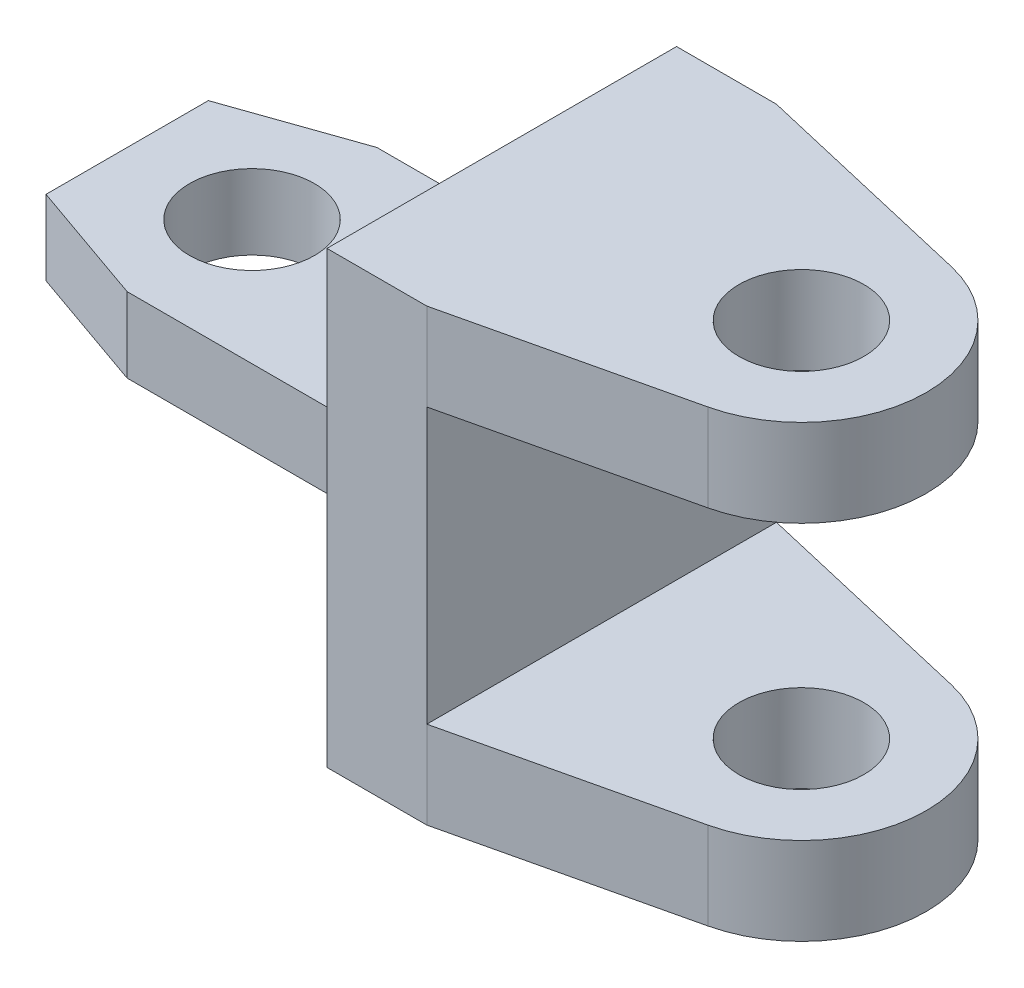
ISO-10303-21;
HEADER;
FILE_DESCRIPTION(('STEP AP214'),'2;1');
FILE_NAME('part.step','',(''),(''),'','','');
FILE_SCHEMA(('AUTOMOTIVE_DESIGN { 1 0 10303 214 1 1 1 1 }'));
ENDSEC;
DATA;
#1=APPLICATION_CONTEXT('core data for automotive mechanical design processes');
#2=APPLICATION_PROTOCOL_DEFINITION('international standard','automotive_design',2000,#1);
#3=PRODUCT_CONTEXT('',#1,'mechanical');
#4=PRODUCT('Part','Part','',(#3));
#5=PRODUCT_RELATED_PRODUCT_CATEGORY('part','',(#4));
#6=PRODUCT_DEFINITION_FORMATION('','',#4);
#7=PRODUCT_DEFINITION_CONTEXT('part definition',#1,'design');
#8=PRODUCT_DEFINITION('design','',#6,#7);
#9=PRODUCT_DEFINITION_SHAPE('','',#8);
#10=(LENGTH_UNIT() NAMED_UNIT(*) SI_UNIT(.MILLI.,.METRE.));
#11=(NAMED_UNIT(*) PLANE_ANGLE_UNIT() SI_UNIT($,.RADIAN.));
#12=(NAMED_UNIT(*) SI_UNIT($,.STERADIAN.) SOLID_ANGLE_UNIT());
#13=UNCERTAINTY_MEASURE_WITH_UNIT(LENGTH_MEASURE(1.E-05),#10,'distance_accuracy_value','');
#14=(GEOMETRIC_REPRESENTATION_CONTEXT(3) GLOBAL_UNCERTAINTY_ASSIGNED_CONTEXT((#13)) GLOBAL_UNIT_ASSIGNED_CONTEXT((#10,
#11,#12)) REPRESENTATION_CONTEXT('',''));
#15=CARTESIAN_POINT('',(0.,0.,0.));
#16=DIRECTION('',(0.,0.,1.));
#17=DIRECTION('',(1.,0.,0.));
#18=AXIS2_PLACEMENT_3D('',#15,#16,#17);
#19=CARTESIAN_POINT('',(3.50943705038397,-18.,15.0473193047414));
#20=DIRECTION('',(0.227131156084319,0.,0.973864178382078));
#21=DIRECTION('',(0.973864178382079,0.,-0.227131156084319));
#22=AXIS2_PLACEMENT_3D('',#19,#20,#21);
#23=PLANE('',#22);
#24=DIRECTION('',(0.973864178382079,0.,-0.227131156084319));
#25=VECTOR('',#24,1.);
#26=CARTESIAN_POINT('',(3.50943705038397,-11.,15.0473193047414));
#27=LINE('',#26,#25);
#28=CARTESIAN_POINT('',(8.,-11.,14.));
#29=VERTEX_POINT('',#28);
#30=CARTESIAN_POINT('',(26.2713115608432,-11.,9.73864178382079));
#31=VERTEX_POINT('',#30);
#32=EDGE_CURVE('E217',#29,#31,#27,.T.);
#33=ORIENTED_EDGE('',*,*,#32,.F.);
#34=DIRECTION('',(0.,1.,0.));
#35=VECTOR('',#34,1.);
#36=CARTESIAN_POINT('',(8.,-18.,14.));
#37=LINE('',#36,#35);
#38=CARTESIAN_POINT('',(8.,-18.,14.));
#39=VERTEX_POINT('',#38);
#40=EDGE_CURVE('E193',#39,#29,#37,.T.);
#41=ORIENTED_EDGE('',*,*,#40,.F.);
#42=DIRECTION('',(0.973864178382079,0.,-0.227131156084319));
#43=VECTOR('',#42,1.);
#44=CARTESIAN_POINT('',(3.50943705038397,-18.,15.0473193047414));
#45=LINE('',#44,#43);
#46=CARTESIAN_POINT('',(26.2713115608432,-18.,9.73864178382079));
#47=VERTEX_POINT('',#46);
#48=EDGE_CURVE('E334',#39,#47,#45,.T.);
#49=ORIENTED_EDGE('',*,*,#48,.T.);
#50=DIRECTION('',(0.,1.,0.));
#51=VECTOR('',#50,1.);
#52=CARTESIAN_POINT('',(26.2713115608432,-18.,9.73864178382079));
#53=LINE('',#52,#51);
#54=EDGE_CURVE('E373',#47,#31,#53,.T.);
#55=ORIENTED_EDGE('',*,*,#54,.T.);
#56=EDGE_LOOP('',(#33,#41,#49,#55));
#57=FACE_BOUND('',#56,.T.);
#58=ADVANCED_FACE('F49',(#57),#23,.T.);
#59=CARTESIAN_POINT('',(3.50943705038397,-18.,-15.0473193047414));
#60=DIRECTION('',(-0.227131156084319,0.,0.973864178382078));
#61=DIRECTION('',(0.973864178382079,0.,0.227131156084319));
#62=AXIS2_PLACEMENT_3D('',#59,#60,#61);
#63=PLANE('',#62);
#64=DIRECTION('',(0.,1.,0.));
#65=VECTOR('',#64,1.);
#66=CARTESIAN_POINT('',(8.,-18.,-14.));
#67=LINE('',#66,#65);
#68=CARTESIAN_POINT('',(8.,-18.,-14.));
#69=VERTEX_POINT('',#68);
#70=CARTESIAN_POINT('',(8.,-11.,-14.));
#71=VERTEX_POINT('',#70);
#72=EDGE_CURVE('E363',#69,#71,#67,.T.);
#73=ORIENTED_EDGE('',*,*,#72,.T.);
#74=DIRECTION('',(0.973864178382079,0.,0.227131156084319));
#75=VECTOR('',#74,1.);
#76=CARTESIAN_POINT('',(3.50943705038397,-11.,-15.0473193047414));
#77=LINE('',#76,#75);
#78=CARTESIAN_POINT('',(26.2713115608432,-11.,-9.73864178382079));
#79=VERTEX_POINT('',#78);
#80=EDGE_CURVE('E213',#71,#79,#77,.T.);
#81=ORIENTED_EDGE('',*,*,#80,.T.);
#82=DIRECTION('',(0.,1.,0.));
#83=VECTOR('',#82,1.);
#84=CARTESIAN_POINT('',(26.2713115608432,-18.,-9.73864178382079));
#85=LINE('',#84,#83);
#86=CARTESIAN_POINT('',(26.2713115608432,-18.,-9.73864178382079));
#87=VERTEX_POINT('',#86);
#88=EDGE_CURVE('E368',#87,#79,#85,.T.);
#89=ORIENTED_EDGE('',*,*,#88,.F.);
#90=DIRECTION('',(0.973864178382079,0.,0.227131156084319));
#91=VECTOR('',#90,1.);
#92=CARTESIAN_POINT('',(3.50943705038397,-18.,-15.0473193047414));
#93=LINE('',#92,#91);
#94=EDGE_CURVE('E342',#69,#87,#93,.T.);
#95=ORIENTED_EDGE('',*,*,#94,.F.);
#96=EDGE_LOOP('',(#73,#81,#89,#95));
#97=FACE_BOUND('',#96,.T.);
#98=ADVANCED_FACE('F521',(#97),#63,.F.);
#99=CARTESIAN_POINT('',(24.,-18.,0.));
#100=DIRECTION('',(0.,1.,0.));
#101=DIRECTION('',(0.,0.,1.));
#102=AXIS2_PLACEMENT_3D('',#99,#100,#101);
#103=CYLINDRICAL_SURFACE('',#102,5.);
#104=CARTESIAN_POINT('',(24.,-11.,0.));
#105=DIRECTION('',(0.,-1.,0.));
#106=DIRECTION('',(1.,0.,0.));
#107=AXIS2_PLACEMENT_3D('',#104,#105,#106);
#108=CIRCLE('',#107,5.);
#109=CARTESIAN_POINT('',(29.,-11.,0.));
#110=VERTEX_POINT('',#109);
#111=EDGE_CURVE('E220',#110,#110,#108,.F.);
#112=ORIENTED_EDGE('',*,*,#111,.T.);
#113=EDGE_LOOP('',(#112));
#114=FACE_BOUND('',#113,.T.);
#115=CARTESIAN_POINT('',(24.,-18.,0.));
#116=DIRECTION('',(0.,1.,0.));
#117=DIRECTION('',(0.,0.,1.));
#118=AXIS2_PLACEMENT_3D('',#115,#116,#117);
#119=CIRCLE('',#118,5.);
#120=CARTESIAN_POINT('',(24.,-18.,5.));
#121=VERTEX_POINT('',#120);
#122=EDGE_CURVE('E330',#121,#121,#119,.T.);
#123=ORIENTED_EDGE('',*,*,#122,.F.);
#124=EDGE_LOOP('',(#123));
#125=FACE_BOUND('',#124,.T.);
#126=ADVANCED_FACE('F535',(#114,#125),#103,.F.);
#127=CARTESIAN_POINT('',(24.,-18.,0.));
#128=DIRECTION('',(0.,1.,0.));
#129=DIRECTION('',(0.,0.,1.));
#130=AXIS2_PLACEMENT_3D('',#127,#128,#129);
#131=CYLINDRICAL_SURFACE('',#130,10.);
#132=CARTESIAN_POINT('',(24.,-11.,0.));
#133=DIRECTION('',(0.,-1.,0.));
#134=DIRECTION('',(1.,0.,0.));
#135=AXIS2_PLACEMENT_3D('',#132,#133,#134);
#136=CIRCLE('',#135,10.);
#137=EDGE_CURVE('E11',#31,#79,#136,.F.);
#138=ORIENTED_EDGE('',*,*,#137,.F.);
#139=ORIENTED_EDGE('',*,*,#54,.F.);
#140=CARTESIAN_POINT('',(24.,-18.,0.));
#141=DIRECTION('',(0.,1.,0.));
#142=DIRECTION('',(0.,0.,1.));
#143=AXIS2_PLACEMENT_3D('',#140,#141,#142);
#144=CIRCLE('',#143,10.);
#145=EDGE_CURVE('E338',#47,#87,#144,.T.);
#146=ORIENTED_EDGE('',*,*,#145,.T.);
#147=ORIENTED_EDGE('',*,*,#88,.T.);
#148=EDGE_LOOP('',(#138,#139,#146,#147));
#149=FACE_BOUND('',#148,.T.);
#150=ADVANCED_FACE('F518',(#149),#131,.T.);
#151=DIRECTION('',(-0.973864178382079,0.,0.227131156084319));
#152=VECTOR('',#151,1.);
#153=CARTESIAN_POINT('',(3.50943705038396,11.,15.0473193047414));
#154=LINE('',#153,#152);
#155=CARTESIAN_POINT('',(26.2713115608432,11.,9.73864178382079));
#156=VERTEX_POINT('',#155);
#157=CARTESIAN_POINT('',(8.,11.,14.));
#158=VERTEX_POINT('',#157);
#159=EDGE_CURVE('E160',#156,#158,#154,.T.);
#160=ORIENTED_EDGE('',*,*,#159,.F.);
#161=CARTESIAN_POINT('',(26.2713115608432,18.,9.73864178382079));
#162=VERTEX_POINT('',#161);
#163=EDGE_CURVE('E355',#156,#162,#53,.T.);
#164=ORIENTED_EDGE('',*,*,#163,.T.);
#165=DIRECTION('',(0.973864178382079,0.,-0.227131156084319));
#166=VECTOR('',#165,1.);
#167=CARTESIAN_POINT('',(3.50943705038397,18.,15.0473193047414));
#168=LINE('',#167,#166);
#169=CARTESIAN_POINT('',(8.,18.,14.));
#170=VERTEX_POINT('',#169);
#171=EDGE_CURVE('E188',#170,#162,#168,.T.);
#172=ORIENTED_EDGE('',*,*,#171,.F.);
#173=EDGE_CURVE('E185',#158,#170,#37,.T.);
#174=ORIENTED_EDGE('',*,*,#173,.F.);
#175=EDGE_LOOP('',(#160,#164,#172,#174));
#176=FACE_BOUND('',#175,.T.);
#177=ADVANCED_FACE('F186',(#176),#23,.T.);
#178=CARTESIAN_POINT('',(0.,-18.,14.));
#179=DIRECTION('',(0.,0.,1.));
#180=DIRECTION('',(1.,0.,0.));
#181=AXIS2_PLACEMENT_3D('',#178,#179,#180);
#182=PLANE('',#181);
#183=ORIENTED_EDGE('',*,*,#40,.T.);
#184=DIRECTION('',(0.,1.,0.));
#185=VECTOR('',#184,1.);
#186=CARTESIAN_POINT('',(8.,11.,14.));
#187=LINE('',#186,#185);
#188=EDGE_CURVE('E177',#29,#158,#187,.T.);
#189=ORIENTED_EDGE('',*,*,#188,.T.);
#190=ORIENTED_EDGE('',*,*,#173,.T.);
#191=DIRECTION('',(1.,0.,0.));
#192=VECTOR('',#191,1.);
#193=CARTESIAN_POINT('',(0.,18.,14.));
#194=LINE('',#193,#192);
#195=CARTESIAN_POINT('',(0.,18.,14.));
#196=VERTEX_POINT('',#195);
#197=EDGE_CURVE('E327',#196,#170,#194,.T.);
#198=ORIENTED_EDGE('',*,*,#197,.F.);
#199=DIRECTION('',(0.,1.,0.));
#200=VECTOR('',#199,1.);
#201=CARTESIAN_POINT('',(0.,-18.,14.));
#202=LINE('',#201,#200);
#203=CARTESIAN_POINT('',(0.,-18.,14.));
#204=VERTEX_POINT('',#203);
#205=EDGE_CURVE('E194',#204,#196,#202,.T.);
#206=ORIENTED_EDGE('',*,*,#205,.F.);
#207=DIRECTION('',(1.,0.,0.));
#208=VECTOR('',#207,1.);
#209=CARTESIAN_POINT('',(0.,-18.,14.));
#210=LINE('',#209,#208);
#211=EDGE_CURVE('E353',#204,#39,#210,.T.);
#212=ORIENTED_EDGE('',*,*,#211,.T.);
#213=EDGE_LOOP('',(#183,#189,#190,#198,#206,#212));
#214=FACE_BOUND('',#213,.T.);
#215=ADVANCED_FACE('F197',(#214),#182,.T.);
#216=CARTESIAN_POINT('',(0.,-18.,0.));
#217=DIRECTION('',(1.,0.,0.));
#218=DIRECTION('',(0.,0.,-1.));
#219=AXIS2_PLACEMENT_3D('',#216,#217,#218);
#220=PLANE('',#219);
#221=DIRECTION('',(0.,0.,1.));
#222=VECTOR('',#221,1.);
#223=CARTESIAN_POINT('',(0.,-3.,0.));
#224=LINE('',#223,#222);
#225=CARTESIAN_POINT('',(0.,-3.,-10.));
#226=VERTEX_POINT('',#225);
#227=CARTESIAN_POINT('',(0.,-3.,10.));
#228=VERTEX_POINT('',#227);
#229=EDGE_CURVE('E263',#226,#228,#224,.T.);
#230=ORIENTED_EDGE('',*,*,#229,.F.);
#231=DIRECTION('',(0.,1.,0.));
#232=VECTOR('',#231,1.);
#233=CARTESIAN_POINT('',(0.,-3.,-10.));
#234=LINE('',#233,#232);
#235=CARTESIAN_POINT('',(0.,3.,-10.));
#236=VERTEX_POINT('',#235);
#237=EDGE_CURVE('E73',#226,#236,#234,.T.);
#238=ORIENTED_EDGE('',*,*,#237,.T.);
#239=DIRECTION('',(0.,0.,1.));
#240=VECTOR('',#239,1.);
#241=CARTESIAN_POINT('',(0.,3.,0.));
#242=LINE('',#241,#240);
#243=CARTESIAN_POINT('',(0.,3.,10.));
#244=VERTEX_POINT('',#243);
#245=EDGE_CURVE('E232',#236,#244,#242,.T.);
#246=ORIENTED_EDGE('',*,*,#245,.T.);
#247=DIRECTION('',(0.,1.,0.));
#248=VECTOR('',#247,1.);
#249=CARTESIAN_POINT('',(0.,-3.,10.));
#250=LINE('',#249,#248);
#251=EDGE_CURVE('E287',#228,#244,#250,.T.);
#252=ORIENTED_EDGE('',*,*,#251,.F.);
#253=EDGE_LOOP('',(#230,#238,#246,#252));
#254=FACE_BOUND('',#253,.T.);
#255=ORIENTED_EDGE('',*,*,#205,.T.);
#256=DIRECTION('',(0.,0.,-1.));
#257=VECTOR('',#256,1.);
#258=CARTESIAN_POINT('',(0.,18.,0.));
#259=LINE('',#258,#257);
#260=CARTESIAN_POINT('',(0.,18.,-14.));
#261=VERTEX_POINT('',#260);
#262=EDGE_CURVE('E323',#196,#261,#259,.T.);
#263=ORIENTED_EDGE('',*,*,#262,.T.);
#264=DIRECTION('',(0.,1.,0.));
#265=VECTOR('',#264,1.);
#266=CARTESIAN_POINT('',(0.,-18.,-14.));
#267=LINE('',#266,#265);
#268=CARTESIAN_POINT('',(0.,-18.,-14.));
#269=VERTEX_POINT('',#268);
#270=EDGE_CURVE('E360',#269,#261,#267,.T.);
#271=ORIENTED_EDGE('',*,*,#270,.F.);
#272=DIRECTION('',(0.,0.,-1.));
#273=VECTOR('',#272,1.);
#274=CARTESIAN_POINT('',(0.,-18.,0.));
#275=LINE('',#274,#273);
#276=EDGE_CURVE('E349',#204,#269,#275,.T.);
#277=ORIENTED_EDGE('',*,*,#276,.F.);
#278=EDGE_LOOP('',(#255,#263,#271,#277));
#279=FACE_BOUND('',#278,.T.);
#280=ADVANCED_FACE('F507',(#254,#279),#220,.F.);
#281=CARTESIAN_POINT('',(0.,-18.,-14.));
#282=DIRECTION('',(0.,0.,1.));
#283=DIRECTION('',(1.,0.,0.));
#284=AXIS2_PLACEMENT_3D('',#281,#282,#283);
#285=PLANE('',#284);
#286=ORIENTED_EDGE('',*,*,#270,.T.);
#287=DIRECTION('',(1.,0.,0.));
#288=VECTOR('',#287,1.);
#289=CARTESIAN_POINT('',(0.,18.,-14.));
#290=LINE('',#289,#288);
#291=CARTESIAN_POINT('',(8.,18.,-14.));
#292=VERTEX_POINT('',#291);
#293=EDGE_CURVE('E319',#261,#292,#290,.T.);
#294=ORIENTED_EDGE('',*,*,#293,.T.);
#295=CARTESIAN_POINT('',(8.,11.,-14.));
#296=VERTEX_POINT('',#295);
#297=EDGE_CURVE('E367',#296,#292,#67,.T.);
#298=ORIENTED_EDGE('',*,*,#297,.F.);
#299=DIRECTION('',(0.,1.,0.));
#300=VECTOR('',#299,1.);
#301=CARTESIAN_POINT('',(8.,11.,-14.));
#302=LINE('',#301,#300);
#303=EDGE_CURVE('E180',#71,#296,#302,.T.);
#304=ORIENTED_EDGE('',*,*,#303,.F.);
#305=ORIENTED_EDGE('',*,*,#72,.F.);
#306=DIRECTION('',(1.,0.,0.));
#307=VECTOR('',#306,1.);
#308=CARTESIAN_POINT('',(0.,-18.,-14.));
#309=LINE('',#308,#307);
#310=EDGE_CURVE('E345',#269,#69,#309,.T.);
#311=ORIENTED_EDGE('',*,*,#310,.F.);
#312=EDGE_LOOP('',(#286,#294,#298,#304,#305,#311));
#313=FACE_BOUND('',#312,.T.);
#314=ADVANCED_FACE('F525',(#313),#285,.F.);
#315=CARTESIAN_POINT('',(26.2713115608432,11.,-9.73864178382079));
#316=VERTEX_POINT('',#315);
#317=CARTESIAN_POINT('',(26.2713115608432,18.,-9.73864178382079));
#318=VERTEX_POINT('',#317);
#319=EDGE_CURVE('E372',#316,#318,#85,.T.);
#320=ORIENTED_EDGE('',*,*,#319,.F.);
#321=DIRECTION('',(-0.973864178382079,0.,-0.227131156084319));
#322=VECTOR('',#321,1.);
#323=CARTESIAN_POINT('',(3.50943705038396,11.,-15.0473193047414));
#324=LINE('',#323,#322);
#325=EDGE_CURVE('E65',#316,#296,#324,.T.);
#326=ORIENTED_EDGE('',*,*,#325,.T.);
#327=ORIENTED_EDGE('',*,*,#297,.T.);
#328=DIRECTION('',(0.973864178382079,0.,0.227131156084319));
#329=VECTOR('',#328,1.);
#330=CARTESIAN_POINT('',(3.50943705038397,18.,-15.0473193047414));
#331=LINE('',#330,#329);
#332=EDGE_CURVE('E315',#292,#318,#331,.T.);
#333=ORIENTED_EDGE('',*,*,#332,.T.);
#334=EDGE_LOOP('',(#320,#326,#327,#333));
#335=FACE_BOUND('',#334,.T.);
#336=ADVANCED_FACE('F527',(#335),#63,.F.);
#337=CARTESIAN_POINT('',(24.,11.,0.));
#338=DIRECTION('',(0.,1.,0.));
#339=DIRECTION('',(-1.,0.,0.));
#340=AXIS2_PLACEMENT_3D('',#337,#338,#339);
#341=CIRCLE('',#340,5.);
#342=CARTESIAN_POINT('',(19.,11.,0.));
#343=VERTEX_POINT('',#342);
#344=EDGE_CURVE('E170',#343,#343,#341,.F.);
#345=ORIENTED_EDGE('',*,*,#344,.T.);
#346=EDGE_LOOP('',(#345));
#347=FACE_BOUND('',#346,.T.);
#348=CARTESIAN_POINT('',(24.,18.,0.));
#349=DIRECTION('',(0.,1.,0.));
#350=DIRECTION('',(0.,0.,1.));
#351=AXIS2_PLACEMENT_3D('',#348,#349,#350);
#352=CIRCLE('',#351,5.);
#353=CARTESIAN_POINT('',(24.,18.,5.));
#354=VERTEX_POINT('',#353);
#355=EDGE_CURVE('E291',#354,#354,#352,.T.);
#356=ORIENTED_EDGE('',*,*,#355,.T.);
#357=EDGE_LOOP('',(#356));
#358=FACE_BOUND('',#357,.T.);
#359=ADVANCED_FACE('F51',(#347,#358),#103,.F.);
#360=CARTESIAN_POINT('',(24.,11.,0.));
#361=DIRECTION('',(0.,1.,0.));
#362=DIRECTION('',(-1.,0.,0.));
#363=AXIS2_PLACEMENT_3D('',#360,#361,#362);
#364=CIRCLE('',#363,10.);
#365=EDGE_CURVE('E58',#316,#156,#364,.F.);
#366=ORIENTED_EDGE('',*,*,#365,.F.);
#367=ORIENTED_EDGE('',*,*,#319,.T.);
#368=CARTESIAN_POINT('',(24.,18.,0.));
#369=DIRECTION('',(0.,1.,0.));
#370=DIRECTION('',(0.,0.,1.));
#371=AXIS2_PLACEMENT_3D('',#368,#369,#370);
#372=CIRCLE('',#371,10.);
#373=EDGE_CURVE('E311',#162,#318,#372,.T.);
#374=ORIENTED_EDGE('',*,*,#373,.F.);
#375=ORIENTED_EDGE('',*,*,#163,.F.);
#376=EDGE_LOOP('',(#366,#367,#374,#375));
#377=FACE_BOUND('',#376,.T.);
#378=ADVANCED_FACE('F496',(#377),#131,.T.);
#379=CARTESIAN_POINT('',(0.,-18.,0.));
#380=DIRECTION('',(0.,1.,0.));
#381=DIRECTION('',(0.,0.,1.));
#382=AXIS2_PLACEMENT_3D('',#379,#380,#381);
#383=PLANE('',#382);
#384=ORIENTED_EDGE('',*,*,#122,.T.);
#385=EDGE_LOOP('',(#384));
#386=FACE_BOUND('',#385,.T.);
#387=ORIENTED_EDGE('',*,*,#48,.F.);
#388=ORIENTED_EDGE('',*,*,#211,.F.);
#389=ORIENTED_EDGE('',*,*,#276,.T.);
#390=ORIENTED_EDGE('',*,*,#310,.T.);
#391=ORIENTED_EDGE('',*,*,#94,.T.);
#392=ORIENTED_EDGE('',*,*,#145,.F.);
#393=EDGE_LOOP('',(#387,#388,#389,#390,#391,#392));
#394=FACE_BOUND('',#393,.T.);
#395=ADVANCED_FACE('F510',(#386,#394),#383,.F.);
#396=CARTESIAN_POINT('',(0.,18.,0.));
#397=DIRECTION('',(0.,1.,0.));
#398=DIRECTION('',(0.,0.,1.));
#399=AXIS2_PLACEMENT_3D('',#396,#397,#398);
#400=PLANE('',#399);
#401=ORIENTED_EDGE('',*,*,#355,.F.);
#402=EDGE_LOOP('',(#401));
#403=FACE_BOUND('',#402,.T.);
#404=ORIENTED_EDGE('',*,*,#171,.T.);
#405=ORIENTED_EDGE('',*,*,#373,.T.);
#406=ORIENTED_EDGE('',*,*,#332,.F.);
#407=ORIENTED_EDGE('',*,*,#293,.F.);
#408=ORIENTED_EDGE('',*,*,#262,.F.);
#409=ORIENTED_EDGE('',*,*,#197,.T.);
#410=EDGE_LOOP('',(#404,#405,#406,#407,#408,#409));
#411=FACE_BOUND('',#410,.T.);
#412=ADVANCED_FACE('F500',(#403,#411),#400,.T.);
#413=CARTESIAN_POINT('',(0.,-3.,10.));
#414=DIRECTION('',(0.,0.,1.));
#415=DIRECTION('',(1.,0.,0.));
#416=AXIS2_PLACEMENT_3D('',#413,#414,#415);
#417=PLANE('',#416);
#418=ORIENTED_EDGE('',*,*,#251,.T.);
#419=DIRECTION('',(1.,0.,0.));
#420=VECTOR('',#419,1.);
#421=CARTESIAN_POINT('',(0.,3.,10.));
#422=LINE('',#421,#420);
#423=CARTESIAN_POINT('',(-20.,3.,10.));
#424=VERTEX_POINT('',#423);
#425=EDGE_CURVE('E228',#424,#244,#422,.T.);
#426=ORIENTED_EDGE('',*,*,#425,.F.);
#427=DIRECTION('',(0.,1.,0.));
#428=VECTOR('',#427,1.);
#429=CARTESIAN_POINT('',(-20.,-3.,10.));
#430=LINE('',#429,#428);
#431=CARTESIAN_POINT('',(-20.,-3.,10.));
#432=VERTEX_POINT('',#431);
#433=EDGE_CURVE('E288',#432,#424,#430,.T.);
#434=ORIENTED_EDGE('',*,*,#433,.F.);
#435=DIRECTION('',(1.,0.,0.));
#436=VECTOR('',#435,1.);
#437=CARTESIAN_POINT('',(0.,-3.,10.));
#438=LINE('',#437,#436);
#439=EDGE_CURVE('E259',#432,#228,#438,.T.);
#440=ORIENTED_EDGE('',*,*,#439,.T.);
#441=EDGE_LOOP('',(#418,#426,#434,#440));
#442=FACE_BOUND('',#441,.T.);
#443=ADVANCED_FACE('F563',(#442),#417,.T.);
#444=CARTESIAN_POINT('',(-5.30066815144766,-3.,15.1447661469933));
#445=DIRECTION('',(-0.330350424728106,0.,0.943858356366017));
#446=DIRECTION('',(0.943858356366018,0.,0.330350424728106));
#447=AXIS2_PLACEMENT_3D('',#444,#445,#446);
#448=PLANE('',#447);
#449=ORIENTED_EDGE('',*,*,#433,.T.);
#450=DIRECTION('',(0.943858356366018,0.,0.330350424728106));
#451=VECTOR('',#450,1.);
#452=CARTESIAN_POINT('',(-5.30066815144766,3.,15.1447661469933));
#453=LINE('',#452,#451);
#454=CARTESIAN_POINT('',(-30.,3.,6.5));
#455=VERTEX_POINT('',#454);
#456=EDGE_CURVE('E247',#455,#424,#453,.T.);
#457=ORIENTED_EDGE('',*,*,#456,.F.);
#458=DIRECTION('',(0.,1.,0.));
#459=VECTOR('',#458,1.);
#460=CARTESIAN_POINT('',(-30.,-3.,6.5));
#461=LINE('',#460,#459);
#462=CARTESIAN_POINT('',(-30.,-3.,6.5));
#463=VERTEX_POINT('',#462);
#464=EDGE_CURVE('E292',#463,#455,#461,.T.);
#465=ORIENTED_EDGE('',*,*,#464,.F.);
#466=DIRECTION('',(0.943858356366018,0.,0.330350424728106));
#467=VECTOR('',#466,1.);
#468=CARTESIAN_POINT('',(-5.30066815144766,-3.,15.1447661469933));
#469=LINE('',#468,#467);
#470=EDGE_CURVE('E279',#463,#432,#469,.T.);
#471=ORIENTED_EDGE('',*,*,#470,.T.);
#472=EDGE_LOOP('',(#449,#457,#465,#471));
#473=FACE_BOUND('',#472,.T.);
#474=ADVANCED_FACE('F596',(#473),#448,.T.);
#475=CARTESIAN_POINT('',(-30.,-3.,0.));
#476=DIRECTION('',(1.,0.,0.));
#477=DIRECTION('',(0.,0.,-1.));
#478=AXIS2_PLACEMENT_3D('',#475,#476,#477);
#479=PLANE('',#478);
#480=ORIENTED_EDGE('',*,*,#464,.T.);
#481=DIRECTION('',(0.,0.,-1.));
#482=VECTOR('',#481,1.);
#483=CARTESIAN_POINT('',(-30.,3.,0.));
#484=LINE('',#483,#482);
#485=CARTESIAN_POINT('',(-30.,3.,-6.5));
#486=VERTEX_POINT('',#485);
#487=EDGE_CURVE('E243',#455,#486,#484,.T.);
#488=ORIENTED_EDGE('',*,*,#487,.T.);
#489=DIRECTION('',(0.,1.,0.));
#490=VECTOR('',#489,1.);
#491=CARTESIAN_POINT('',(-30.,-3.,-6.5));
#492=LINE('',#491,#490);
#493=CARTESIAN_POINT('',(-30.,-3.,-6.5));
#494=VERTEX_POINT('',#493);
#495=EDGE_CURVE('E295',#494,#486,#492,.T.);
#496=ORIENTED_EDGE('',*,*,#495,.F.);
#497=DIRECTION('',(0.,0.,-1.));
#498=VECTOR('',#497,1.);
#499=CARTESIAN_POINT('',(-30.,-3.,0.));
#500=LINE('',#499,#498);
#501=EDGE_CURVE('E275',#463,#494,#500,.T.);
#502=ORIENTED_EDGE('',*,*,#501,.F.);
#503=EDGE_LOOP('',(#480,#488,#496,#502));
#504=FACE_BOUND('',#503,.T.);
#505=ADVANCED_FACE('F590',(#504),#479,.F.);
#506=CARTESIAN_POINT('',(-5.30066815144766,-3.,-15.1447661469933));
#507=DIRECTION('',(0.330350424728106,0.,0.943858356366017));
#508=DIRECTION('',(0.943858356366018,0.,-0.330350424728106));
#509=AXIS2_PLACEMENT_3D('',#506,#507,#508);
#510=PLANE('',#509);
#511=ORIENTED_EDGE('',*,*,#495,.T.);
#512=DIRECTION('',(0.943858356366018,0.,-0.330350424728106));
#513=VECTOR('',#512,1.);
#514=CARTESIAN_POINT('',(-5.30066815144766,3.,-15.1447661469933));
#515=LINE('',#514,#513);
#516=CARTESIAN_POINT('',(-20.,3.,-10.));
#517=VERTEX_POINT('',#516);
#518=EDGE_CURVE('E239',#486,#517,#515,.T.);
#519=ORIENTED_EDGE('',*,*,#518,.T.);
#520=DIRECTION('',(0.,1.,0.));
#521=VECTOR('',#520,1.);
#522=CARTESIAN_POINT('',(-20.,-3.,-10.));
#523=LINE('',#522,#521);
#524=CARTESIAN_POINT('',(-20.,-3.,-10.));
#525=VERTEX_POINT('',#524);
#526=EDGE_CURVE('E298',#525,#517,#523,.T.);
#527=ORIENTED_EDGE('',*,*,#526,.F.);
#528=DIRECTION('',(0.943858356366018,0.,-0.330350424728106));
#529=VECTOR('',#528,1.);
#530=CARTESIAN_POINT('',(-5.30066815144766,-3.,-15.1447661469933));
#531=LINE('',#530,#529);
#532=EDGE_CURVE('E271',#494,#525,#531,.T.);
#533=ORIENTED_EDGE('',*,*,#532,.F.);
#534=EDGE_LOOP('',(#511,#519,#527,#533));
#535=FACE_BOUND('',#534,.T.);
#536=ADVANCED_FACE('F586',(#535),#510,.F.);
#537=CARTESIAN_POINT('',(0.,-3.,-10.));
#538=DIRECTION('',(0.,0.,1.));
#539=DIRECTION('',(1.,0.,0.));
#540=AXIS2_PLACEMENT_3D('',#537,#538,#539);
#541=PLANE('',#540);
#542=ORIENTED_EDGE('',*,*,#526,.T.);
#543=DIRECTION('',(1.,0.,0.));
#544=VECTOR('',#543,1.);
#545=CARTESIAN_POINT('',(0.,3.,-10.));
#546=LINE('',#545,#544);
#547=EDGE_CURVE('E235',#517,#236,#546,.T.);
#548=ORIENTED_EDGE('',*,*,#547,.T.);
#549=ORIENTED_EDGE('',*,*,#237,.F.);
#550=DIRECTION('',(1.,0.,0.));
#551=VECTOR('',#550,1.);
#552=CARTESIAN_POINT('',(0.,-3.,-10.));
#553=LINE('',#552,#551);
#554=EDGE_CURVE('E267',#525,#226,#553,.T.);
#555=ORIENTED_EDGE('',*,*,#554,.F.);
#556=EDGE_LOOP('',(#542,#548,#549,#555));
#557=FACE_BOUND('',#556,.T.);
#558=ADVANCED_FACE('F578',(#557),#541,.F.);
#559=CARTESIAN_POINT('',(-7.,-3.,0.));
#560=DIRECTION('',(0.,1.,0.));
#561=DIRECTION('',(0.,0.,1.));
#562=AXIS2_PLACEMENT_3D('',#559,#560,#561);
#563=CYLINDRICAL_SURFACE('',#562,3.);
#564=CARTESIAN_POINT('',(-7.,-3.,0.));
#565=DIRECTION('',(0.,1.,0.));
#566=DIRECTION('',(0.,0.,1.));
#567=AXIS2_PLACEMENT_3D('',#564,#565,#566);
#568=CIRCLE('',#567,3.);
#569=CARTESIAN_POINT('',(-7.,-3.,3.));
#570=VERTEX_POINT('',#569);
#571=EDGE_CURVE('E255',#570,#570,#568,.T.);
#572=ORIENTED_EDGE('',*,*,#571,.F.);
#573=EDGE_LOOP('',(#572));
#574=FACE_BOUND('',#573,.T.);
#575=CARTESIAN_POINT('',(-7.,3.,0.));
#576=DIRECTION('',(0.,1.,0.));
#577=DIRECTION('',(0.,0.,1.));
#578=AXIS2_PLACEMENT_3D('',#575,#576,#577);
#579=CIRCLE('',#578,3.);
#580=CARTESIAN_POINT('',(-7.,3.,3.));
#581=VERTEX_POINT('',#580);
#582=EDGE_CURVE('E224',#581,#581,#579,.T.);
#583=ORIENTED_EDGE('',*,*,#582,.T.);
#584=EDGE_LOOP('',(#583));
#585=FACE_BOUND('',#584,.T.);
#586=ADVANCED_FACE('F611',(#574,#585),#563,.F.);
#587=CARTESIAN_POINT('',(-20.,-3.,0.));
#588=DIRECTION('',(0.,1.,0.));
#589=DIRECTION('',(0.,0.,1.));
#590=AXIS2_PLACEMENT_3D('',#587,#588,#589);
#591=CYLINDRICAL_SURFACE('',#590,5.);
#592=CARTESIAN_POINT('',(-20.,-3.,0.));
#593=DIRECTION('',(0.,1.,0.));
#594=DIRECTION('',(0.,0.,1.));
#595=AXIS2_PLACEMENT_3D('',#592,#593,#594);
#596=CIRCLE('',#595,5.);
#597=CARTESIAN_POINT('',(-20.,-3.,5.));
#598=VERTEX_POINT('',#597);
#599=EDGE_CURVE('E283',#598,#598,#596,.T.);
#600=ORIENTED_EDGE('',*,*,#599,.F.);
#601=EDGE_LOOP('',(#600));
#602=FACE_BOUND('',#601,.T.);
#603=CARTESIAN_POINT('',(-20.,3.,0.));
#604=DIRECTION('',(0.,1.,0.));
#605=DIRECTION('',(0.,0.,1.));
#606=AXIS2_PLACEMENT_3D('',#603,#604,#605);
#607=CIRCLE('',#606,5.);
#608=CARTESIAN_POINT('',(-20.,3.,5.));
#609=VERTEX_POINT('',#608);
#610=EDGE_CURVE('E251',#609,#609,#607,.T.);
#611=ORIENTED_EDGE('',*,*,#610,.T.);
#612=EDGE_LOOP('',(#611));
#613=FACE_BOUND('',#612,.T.);
#614=ADVANCED_FACE('F605',(#602,#613),#591,.F.);
#615=CARTESIAN_POINT('',(0.,-3.,0.));
#616=DIRECTION('',(0.,1.,0.));
#617=DIRECTION('',(0.,0.,1.));
#618=AXIS2_PLACEMENT_3D('',#615,#616,#617);
#619=PLANE('',#618);
#620=ORIENTED_EDGE('',*,*,#571,.T.);
#621=EDGE_LOOP('',(#620));
#622=FACE_BOUND('',#621,.T.);
#623=ORIENTED_EDGE('',*,*,#439,.F.);
#624=ORIENTED_EDGE('',*,*,#470,.F.);
#625=ORIENTED_EDGE('',*,*,#501,.T.);
#626=ORIENTED_EDGE('',*,*,#532,.T.);
#627=ORIENTED_EDGE('',*,*,#554,.T.);
#628=ORIENTED_EDGE('',*,*,#229,.T.);
#629=EDGE_LOOP('',(#623,#624,#625,#626,#627,#628));
#630=FACE_BOUND('',#629,.T.);
#631=ORIENTED_EDGE('',*,*,#599,.T.);
#632=EDGE_LOOP('',(#631));
#633=FACE_BOUND('',#632,.T.);
#634=ADVANCED_FACE('F574',(#622,#630,#633),#619,.F.);
#635=CARTESIAN_POINT('',(0.,3.,0.));
#636=DIRECTION('',(0.,1.,0.));
#637=DIRECTION('',(0.,0.,1.));
#638=AXIS2_PLACEMENT_3D('',#635,#636,#637);
#639=PLANE('',#638);
#640=ORIENTED_EDGE('',*,*,#582,.F.);
#641=EDGE_LOOP('',(#640));
#642=FACE_BOUND('',#641,.T.);
#643=ORIENTED_EDGE('',*,*,#425,.T.);
#644=ORIENTED_EDGE('',*,*,#245,.F.);
#645=ORIENTED_EDGE('',*,*,#547,.F.);
#646=ORIENTED_EDGE('',*,*,#518,.F.);
#647=ORIENTED_EDGE('',*,*,#487,.F.);
#648=ORIENTED_EDGE('',*,*,#456,.T.);
#649=EDGE_LOOP('',(#643,#644,#645,#646,#647,#648));
#650=FACE_BOUND('',#649,.T.);
#651=ORIENTED_EDGE('',*,*,#610,.F.);
#652=EDGE_LOOP('',(#651));
#653=FACE_BOUND('',#652,.T.);
#654=ADVANCED_FACE('F582',(#642,#650,#653),#639,.T.);
#655=CARTESIAN_POINT('',(8.,-11.,14.));
#656=DIRECTION('',(0.,-1.,0.));
#657=DIRECTION('',(1.,0.,0.));
#658=AXIS2_PLACEMENT_3D('',#655,#656,#657);
#659=PLANE('',#658);
#660=ORIENTED_EDGE('',*,*,#32,.T.);
#661=ORIENTED_EDGE('',*,*,#137,.T.);
#662=ORIENTED_EDGE('',*,*,#80,.F.);
#663=DIRECTION('',(0.,0.,-1.));
#664=VECTOR('',#663,1.);
#665=CARTESIAN_POINT('',(8.,-11.,14.));
#666=LINE('',#665,#664);
#667=EDGE_CURVE('E182',#29,#71,#666,.T.);
#668=ORIENTED_EDGE('',*,*,#667,.F.);
#669=EDGE_LOOP('',(#660,#661,#662,#668));
#670=FACE_BOUND('',#669,.T.);
#671=ORIENTED_EDGE('',*,*,#111,.F.);
#672=EDGE_LOOP('',(#671));
#673=FACE_BOUND('',#672,.T.);
#674=ADVANCED_FACE('F515',(#670,#673),#659,.F.);
#675=CARTESIAN_POINT('',(8.,11.,14.));
#676=DIRECTION('',(0.,1.,0.));
#677=DIRECTION('',(-1.,0.,0.));
#678=AXIS2_PLACEMENT_3D('',#675,#676,#677);
#679=PLANE('',#678);
#680=ORIENTED_EDGE('',*,*,#159,.T.);
#681=DIRECTION('',(0.,0.,-1.));
#682=VECTOR('',#681,1.);
#683=CARTESIAN_POINT('',(8.,11.,14.));
#684=LINE('',#683,#682);
#685=EDGE_CURVE('E164',#158,#296,#684,.T.);
#686=ORIENTED_EDGE('',*,*,#685,.T.);
#687=ORIENTED_EDGE('',*,*,#325,.F.);
#688=ORIENTED_EDGE('',*,*,#365,.T.);
#689=EDGE_LOOP('',(#680,#686,#687,#688));
#690=FACE_BOUND('',#689,.T.);
#691=ORIENTED_EDGE('',*,*,#344,.F.);
#692=EDGE_LOOP('',(#691));
#693=FACE_BOUND('',#692,.T.);
#694=ADVANCED_FACE('F162',(#690,#693),#679,.F.);
#695=CARTESIAN_POINT('',(8.,11.,14.));
#696=DIRECTION('',(-1.,0.,0.));
#697=DIRECTION('',(0.,0.,1.));
#698=AXIS2_PLACEMENT_3D('',#695,#696,#697);
#699=PLANE('',#698);
#700=ORIENTED_EDGE('',*,*,#303,.T.);
#701=ORIENTED_EDGE('',*,*,#685,.F.);
#702=ORIENTED_EDGE('',*,*,#188,.F.);
#703=ORIENTED_EDGE('',*,*,#667,.T.);
#704=EDGE_LOOP('',(#700,#701,#702,#703));
#705=FACE_BOUND('',#704,.T.);
#706=ADVANCED_FACE('F174',(#705),#699,.F.);
#707=CLOSED_SHELL('',(#58,#98,#126,#150,#177,#215,#280,#314,#336,#359,#378,#395,#412,#443,#474,
#505,#536,#558,#586,#614,#634,#654,#674,#694,#706));
#708=MANIFOLD_SOLID_BREP('B2',#707);
#709=ADVANCED_BREP_SHAPE_REPRESENTATION('',(#18,#708),#14);
#710=SHAPE_DEFINITION_REPRESENTATION(#9,#709);
ENDSEC;
END-ISO-10303-21;
